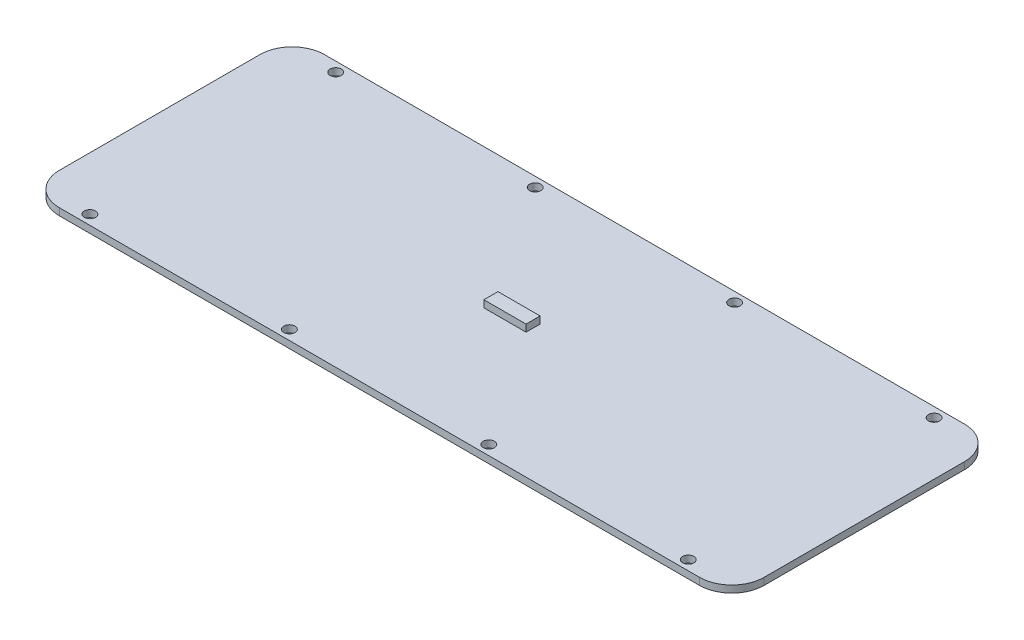
ISO-10303-21;
HEADER;
FILE_DESCRIPTION(('STEP AP214'),'2;1');
FILE_NAME('part.step','',(''),(''),'','','');
FILE_SCHEMA(('AUTOMOTIVE_DESIGN { 1 0 10303 214 1 1 1 1 }'));
ENDSEC;
DATA;
#1=APPLICATION_CONTEXT('core data for automotive mechanical design processes');
#2=APPLICATION_PROTOCOL_DEFINITION('international standard','automotive_design',2000,#1);
#3=PRODUCT_CONTEXT('',#1,'mechanical');
#4=PRODUCT('Part','Part','',(#3));
#5=PRODUCT_RELATED_PRODUCT_CATEGORY('part','',(#4));
#6=PRODUCT_DEFINITION_FORMATION('','',#4);
#7=PRODUCT_DEFINITION_CONTEXT('part definition',#1,'design');
#8=PRODUCT_DEFINITION('design','',#6,#7);
#9=PRODUCT_DEFINITION_SHAPE('','',#8);
#10=(LENGTH_UNIT() NAMED_UNIT(*) SI_UNIT(.MILLI.,.METRE.));
#11=(NAMED_UNIT(*) PLANE_ANGLE_UNIT() SI_UNIT($,.RADIAN.));
#12=(NAMED_UNIT(*) SI_UNIT($,.STERADIAN.) SOLID_ANGLE_UNIT());
#13=UNCERTAINTY_MEASURE_WITH_UNIT(LENGTH_MEASURE(1.E-05),#10,'distance_accuracy_value','');
#14=(GEOMETRIC_REPRESENTATION_CONTEXT(3) GLOBAL_UNCERTAINTY_ASSIGNED_CONTEXT((#13)) GLOBAL_UNIT_ASSIGNED_CONTEXT((#10,
#11,#12)) REPRESENTATION_CONTEXT('',''));
#15=CARTESIAN_POINT('',(0.,0.,0.));
#16=DIRECTION('',(0.,0.,1.));
#17=DIRECTION('',(1.,0.,0.));
#18=AXIS2_PLACEMENT_3D('',#15,#16,#17);
#19=CARTESIAN_POINT('',(-227.9,5.,71.4));
#20=DIRECTION('',(0.,-1.,0.));
#21=DIRECTION('',(0.,0.,-1.));
#22=AXIS2_PLACEMENT_3D('',#19,#20,#21);
#23=PLANE('',#22);
#24=CARTESIAN_POINT('',(-213.,5.,87.5));
#25=DIRECTION('',(0.,1.,0.));
#26=DIRECTION('',(0.,0.,-1.));
#27=AXIS2_PLACEMENT_3D('',#24,#25,#26);
#28=CIRCLE('',#27,3.99999999999999);
#29=CARTESIAN_POINT('',(-213.,5.,83.5));
#30=VERTEX_POINT('',#29);
#31=EDGE_CURVE('E272',#30,#30,#28,.T.);
#32=ORIENTED_EDGE('',*,*,#31,.F.);
#33=EDGE_LOOP('',(#32));
#34=FACE_BOUND('',#33,.T.);
#35=CARTESIAN_POINT('',(-70.9999999999999,5.,87.5));
#36=DIRECTION('',(0.,1.,0.));
#37=DIRECTION('',(0.,0.,-1.));
#38=AXIS2_PLACEMENT_3D('',#35,#36,#37);
#39=CIRCLE('',#38,4.00000000000001);
#40=CARTESIAN_POINT('',(-70.9999999999999,5.,83.5));
#41=VERTEX_POINT('',#40);
#42=EDGE_CURVE('E264',#41,#41,#39,.T.);
#43=ORIENTED_EDGE('',*,*,#42,.F.);
#44=EDGE_LOOP('',(#43));
#45=FACE_BOUND('',#44,.T.);
#46=CARTESIAN_POINT('',(71.0000000000001,5.,87.4999999999999));
#47=DIRECTION('',(0.,1.,0.));
#48=DIRECTION('',(0.,0.,-1.));
#49=AXIS2_PLACEMENT_3D('',#46,#47,#48);
#50=CIRCLE('',#49,4.00000000000001);
#51=CARTESIAN_POINT('',(71.0000000000001,5.,83.4999999999999));
#52=VERTEX_POINT('',#51);
#53=EDGE_CURVE('E256',#52,#52,#50,.T.);
#54=ORIENTED_EDGE('',*,*,#53,.F.);
#55=EDGE_LOOP('',(#54));
#56=FACE_BOUND('',#55,.T.);
#57=CARTESIAN_POINT('',(213.,5.,87.4999999999999));
#58=DIRECTION('',(0.,1.,0.));
#59=DIRECTION('',(0.,0.,-1.));
#60=AXIS2_PLACEMENT_3D('',#57,#58,#59);
#61=CIRCLE('',#60,3.99999999999999);
#62=CARTESIAN_POINT('',(213.,5.,83.4999999999999));
#63=VERTEX_POINT('',#62);
#64=EDGE_CURVE('E248',#63,#63,#61,.T.);
#65=ORIENTED_EDGE('',*,*,#64,.F.);
#66=EDGE_LOOP('',(#65));
#67=FACE_BOUND('',#66,.T.);
#68=CARTESIAN_POINT('',(213.,5.,-87.5));
#69=DIRECTION('',(0.,1.,0.));
#70=DIRECTION('',(0.,0.,1.));
#71=AXIS2_PLACEMENT_3D('',#68,#69,#70);
#72=CIRCLE('',#71,3.99999999999999);
#73=CARTESIAN_POINT('',(213.,5.,-83.5));
#74=VERTEX_POINT('',#73);
#75=EDGE_CURVE('E240',#74,#74,#72,.T.);
#76=ORIENTED_EDGE('',*,*,#75,.F.);
#77=EDGE_LOOP('',(#76));
#78=FACE_BOUND('',#77,.T.);
#79=CARTESIAN_POINT('',(71.0000000000001,5.,-87.5));
#80=DIRECTION('',(0.,1.,0.));
#81=DIRECTION('',(0.,0.,1.));
#82=AXIS2_PLACEMENT_3D('',#79,#80,#81);
#83=CIRCLE('',#82,4.00000000000001);
#84=CARTESIAN_POINT('',(71.0000000000001,5.,-83.5));
#85=VERTEX_POINT('',#84);
#86=EDGE_CURVE('E232',#85,#85,#83,.T.);
#87=ORIENTED_EDGE('',*,*,#86,.F.);
#88=EDGE_LOOP('',(#87));
#89=FACE_BOUND('',#88,.T.);
#90=CARTESIAN_POINT('',(-70.9999999999999,5.,-87.5));
#91=DIRECTION('',(0.,1.,0.));
#92=DIRECTION('',(0.,0.,1.));
#93=AXIS2_PLACEMENT_3D('',#90,#91,#92);
#94=CIRCLE('',#93,4.00000000000001);
#95=CARTESIAN_POINT('',(-70.9999999999999,5.,-83.4999999999999));
#96=VERTEX_POINT('',#95);
#97=EDGE_CURVE('E224',#96,#96,#94,.T.);
#98=ORIENTED_EDGE('',*,*,#97,.F.);
#99=EDGE_LOOP('',(#98));
#100=FACE_BOUND('',#99,.T.);
#101=CARTESIAN_POINT('',(-213.,5.,-87.5));
#102=DIRECTION('',(0.,1.,0.));
#103=DIRECTION('',(0.,0.,1.));
#104=AXIS2_PLACEMENT_3D('',#101,#102,#103);
#105=CIRCLE('',#104,3.99999999999999);
#106=CARTESIAN_POINT('',(-213.,5.,-83.5));
#107=VERTEX_POINT('',#106);
#108=EDGE_CURVE('E157',#107,#107,#105,.T.);
#109=ORIENTED_EDGE('',*,*,#108,.F.);
#110=EDGE_LOOP('',(#109));
#111=FACE_BOUND('',#110,.T.);
#112=CARTESIAN_POINT('',(-227.9,5.,71.4));
#113=DIRECTION('',(0.,1.,0.));
#114=DIRECTION('',(0.,0.,-1.));
#115=AXIS2_PLACEMENT_3D('',#112,#113,#114);
#116=CIRCLE('',#115,23.);
#117=CARTESIAN_POINT('',(-250.9,5.,71.4));
#118=VERTEX_POINT('',#117);
#119=CARTESIAN_POINT('',(-227.9,5.,94.4));
#120=VERTEX_POINT('',#119);
#121=EDGE_CURVE('E175',#118,#120,#116,.T.);
#122=ORIENTED_EDGE('',*,*,#121,.T.);
#123=DIRECTION('',(1.,0.,0.));
#124=VECTOR('',#123,1.);
#125=CARTESIAN_POINT('',(-227.9,5.,94.4));
#126=LINE('',#125,#124);
#127=CARTESIAN_POINT('',(227.9,5.,94.4));
#128=VERTEX_POINT('',#127);
#129=EDGE_CURVE('E109',#120,#128,#126,.T.);
#130=ORIENTED_EDGE('',*,*,#129,.T.);
#131=CARTESIAN_POINT('',(227.9,5.,71.4));
#132=DIRECTION('',(0.,1.,0.));
#133=DIRECTION('',(0.,0.,1.));
#134=AXIS2_PLACEMENT_3D('',#131,#132,#133);
#135=CIRCLE('',#134,23.);
#136=CARTESIAN_POINT('',(250.9,5.,71.4));
#137=VERTEX_POINT('',#136);
#138=EDGE_CURVE('E196',#128,#137,#135,.T.);
#139=ORIENTED_EDGE('',*,*,#138,.T.);
#140=DIRECTION('',(0.,0.,-1.));
#141=VECTOR('',#140,1.);
#142=CARTESIAN_POINT('',(250.9,5.,71.4));
#143=LINE('',#142,#141);
#144=CARTESIAN_POINT('',(250.9,5.,-71.4));
#145=VERTEX_POINT('',#144);
#146=EDGE_CURVE('E210',#137,#145,#143,.T.);
#147=ORIENTED_EDGE('',*,*,#146,.T.);
#148=CARTESIAN_POINT('',(227.9,5.,-71.4));
#149=DIRECTION('',(0.,1.,0.));
#150=DIRECTION('',(0.,0.,-1.));
#151=AXIS2_PLACEMENT_3D('',#148,#149,#150);
#152=CIRCLE('',#151,23.);
#153=CARTESIAN_POINT('',(227.9,5.,-94.4));
#154=VERTEX_POINT('',#153);
#155=EDGE_CURVE('E130',#145,#154,#152,.T.);
#156=ORIENTED_EDGE('',*,*,#155,.T.);
#157=DIRECTION('',(-1.,0.,0.));
#158=VECTOR('',#157,1.);
#159=CARTESIAN_POINT('',(-227.9,5.,-94.4));
#160=LINE('',#159,#158);
#161=CARTESIAN_POINT('',(-227.9,5.,-94.4));
#162=VERTEX_POINT('',#161);
#163=EDGE_CURVE('E124',#154,#162,#160,.T.);
#164=ORIENTED_EDGE('',*,*,#163,.T.);
#165=CARTESIAN_POINT('',(-227.9,5.,-71.4));
#166=DIRECTION('',(0.,1.,0.));
#167=DIRECTION('',(0.,0.,-1.));
#168=AXIS2_PLACEMENT_3D('',#165,#166,#167);
#169=CIRCLE('',#168,23.);
#170=CARTESIAN_POINT('',(-250.9,5.,-71.4));
#171=VERTEX_POINT('',#170);
#172=EDGE_CURVE('E128',#162,#171,#169,.T.);
#173=ORIENTED_EDGE('',*,*,#172,.T.);
#174=DIRECTION('',(0.,0.,1.));
#175=VECTOR('',#174,1.);
#176=CARTESIAN_POINT('',(-250.9,5.,71.4));
#177=LINE('',#176,#175);
#178=EDGE_CURVE('E65',#171,#118,#177,.T.);
#179=ORIENTED_EDGE('',*,*,#178,.T.);
#180=EDGE_LOOP('',(#122,#130,#139,#147,#156,#164,#173,#179));
#181=FACE_BOUND('',#180,.T.);
#182=DIRECTION('',(0.,0.,-1.));
#183=VECTOR('',#182,1.);
#184=CARTESIAN_POINT('',(15.,5.,5.00000000000003));
#185=LINE('',#184,#183);
#186=CARTESIAN_POINT('',(15.,5.,5.00000000000003));
#187=VERTEX_POINT('',#186);
#188=CARTESIAN_POINT('',(15.,5.,-4.99999999999997));
#189=VERTEX_POINT('',#188);
#190=EDGE_CURVE('E295',#187,#189,#185,.T.);
#191=ORIENTED_EDGE('',*,*,#190,.F.);
#192=DIRECTION('',(1.,0.,0.));
#193=VECTOR('',#192,1.);
#194=CARTESIAN_POINT('',(-15.,5.,5.00000000000003));
#195=LINE('',#194,#193);
#196=CARTESIAN_POINT('',(-15.,5.,5.00000000000003));
#197=VERTEX_POINT('',#196);
#198=EDGE_CURVE('E280',#197,#187,#195,.T.);
#199=ORIENTED_EDGE('',*,*,#198,.F.);
#200=DIRECTION('',(0.,0.,1.));
#201=VECTOR('',#200,1.);
#202=CARTESIAN_POINT('',(-15.,5.,5.00000000000003));
#203=LINE('',#202,#201);
#204=CARTESIAN_POINT('',(-15.,5.,-4.99999999999997));
#205=VERTEX_POINT('',#204);
#206=EDGE_CURVE('E287',#205,#197,#203,.T.);
#207=ORIENTED_EDGE('',*,*,#206,.F.);
#208=DIRECTION('',(-1.,0.,0.));
#209=VECTOR('',#208,1.);
#210=CARTESIAN_POINT('',(-15.,5.,-4.99999999999997));
#211=LINE('',#210,#209);
#212=EDGE_CURVE('E291',#189,#205,#211,.T.);
#213=ORIENTED_EDGE('',*,*,#212,.F.);
#214=EDGE_LOOP('',(#191,#199,#207,#213));
#215=FACE_BOUND('',#214,.T.);
#216=ADVANCED_FACE('F47',(#34,#45,#56,#67,#78,#89,#100,#111,#181,#215),#23,.F.);
#217=CARTESIAN_POINT('',(-227.9,0.,71.4));
#218=DIRECTION('',(0.,-1.,0.));
#219=DIRECTION('',(0.,0.,-1.));
#220=AXIS2_PLACEMENT_3D('',#217,#218,#219);
#221=PLANE('',#220);
#222=CARTESIAN_POINT('',(-70.9999999999999,0.,87.5));
#223=DIRECTION('',(0.,1.,0.));
#224=DIRECTION('',(0.,0.,-1.));
#225=AXIS2_PLACEMENT_3D('',#222,#223,#224);
#226=CIRCLE('',#225,4.00000000000001);
#227=CARTESIAN_POINT('',(-70.9999999999999,0.,83.5));
#228=VERTEX_POINT('',#227);
#229=EDGE_CURVE('E268',#228,#228,#226,.T.);
#230=ORIENTED_EDGE('',*,*,#229,.T.);
#231=EDGE_LOOP('',(#230));
#232=FACE_BOUND('',#231,.T.);
#233=CARTESIAN_POINT('',(213.,0.,87.4999999999999));
#234=DIRECTION('',(0.,1.,0.));
#235=DIRECTION('',(0.,0.,-1.));
#236=AXIS2_PLACEMENT_3D('',#233,#234,#235);
#237=CIRCLE('',#236,3.99999999999999);
#238=CARTESIAN_POINT('',(213.,0.,83.4999999999999));
#239=VERTEX_POINT('',#238);
#240=EDGE_CURVE('E252',#239,#239,#237,.T.);
#241=ORIENTED_EDGE('',*,*,#240,.T.);
#242=EDGE_LOOP('',(#241));
#243=FACE_BOUND('',#242,.T.);
#244=CARTESIAN_POINT('',(71.0000000000001,0.,-87.5));
#245=DIRECTION('',(0.,1.,0.));
#246=DIRECTION('',(0.,0.,1.));
#247=AXIS2_PLACEMENT_3D('',#244,#245,#246);
#248=CIRCLE('',#247,4.00000000000001);
#249=CARTESIAN_POINT('',(71.0000000000001,0.,-83.5));
#250=VERTEX_POINT('',#249);
#251=EDGE_CURVE('E236',#250,#250,#248,.T.);
#252=ORIENTED_EDGE('',*,*,#251,.T.);
#253=EDGE_LOOP('',(#252));
#254=FACE_BOUND('',#253,.T.);
#255=CARTESIAN_POINT('',(-213.,0.,-87.5));
#256=DIRECTION('',(0.,1.,0.));
#257=DIRECTION('',(0.,0.,1.));
#258=AXIS2_PLACEMENT_3D('',#255,#256,#257);
#259=CIRCLE('',#258,3.99999999999999);
#260=CARTESIAN_POINT('',(-213.,0.,-83.5));
#261=VERTEX_POINT('',#260);
#262=EDGE_CURVE('E220',#261,#261,#259,.T.);
#263=ORIENTED_EDGE('',*,*,#262,.T.);
#264=EDGE_LOOP('',(#263));
#265=FACE_BOUND('',#264,.T.);
#266=CARTESIAN_POINT('',(-227.9,0.,71.4));
#267=DIRECTION('',(0.,1.,0.));
#268=DIRECTION('',(0.,0.,-1.));
#269=AXIS2_PLACEMENT_3D('',#266,#267,#268);
#270=CIRCLE('',#269,23.);
#271=CARTESIAN_POINT('',(-250.9,0.,71.4));
#272=VERTEX_POINT('',#271);
#273=CARTESIAN_POINT('',(-227.9,0.,94.4));
#274=VERTEX_POINT('',#273);
#275=EDGE_CURVE('E152',#272,#274,#270,.T.);
#276=ORIENTED_EDGE('',*,*,#275,.F.);
#277=DIRECTION('',(0.,0.,1.));
#278=VECTOR('',#277,1.);
#279=CARTESIAN_POINT('',(-250.9,0.,71.4));
#280=LINE('',#279,#278);
#281=CARTESIAN_POINT('',(-250.9,0.,-71.4));
#282=VERTEX_POINT('',#281);
#283=EDGE_CURVE('E101',#282,#272,#280,.T.);
#284=ORIENTED_EDGE('',*,*,#283,.F.);
#285=CARTESIAN_POINT('',(-227.9,0.,-71.4));
#286=DIRECTION('',(0.,1.,0.));
#287=DIRECTION('',(0.,0.,-1.));
#288=AXIS2_PLACEMENT_3D('',#285,#286,#287);
#289=CIRCLE('',#288,23.);
#290=CARTESIAN_POINT('',(-227.9,0.,-94.4));
#291=VERTEX_POINT('',#290);
#292=EDGE_CURVE('E95',#291,#282,#289,.T.);
#293=ORIENTED_EDGE('',*,*,#292,.F.);
#294=DIRECTION('',(-1.,0.,0.));
#295=VECTOR('',#294,1.);
#296=CARTESIAN_POINT('',(-227.9,0.,-94.4));
#297=LINE('',#296,#295);
#298=CARTESIAN_POINT('',(227.9,0.,-94.4));
#299=VERTEX_POINT('',#298);
#300=EDGE_CURVE('E139',#299,#291,#297,.T.);
#301=ORIENTED_EDGE('',*,*,#300,.F.);
#302=CARTESIAN_POINT('',(227.9,0.,-71.4));
#303=DIRECTION('',(0.,1.,0.));
#304=DIRECTION('',(0.,0.,-1.));
#305=AXIS2_PLACEMENT_3D('',#302,#303,#304);
#306=CIRCLE('',#305,23.);
#307=CARTESIAN_POINT('',(250.9,0.,-71.4));
#308=VERTEX_POINT('',#307);
#309=EDGE_CURVE('E166',#308,#299,#306,.T.);
#310=ORIENTED_EDGE('',*,*,#309,.F.);
#311=DIRECTION('',(0.,0.,-1.));
#312=VECTOR('',#311,1.);
#313=CARTESIAN_POINT('',(250.9,0.,71.4));
#314=LINE('',#313,#312);
#315=CARTESIAN_POINT('',(250.9,0.,71.4));
#316=VERTEX_POINT('',#315);
#317=EDGE_CURVE('E163',#316,#308,#314,.T.);
#318=ORIENTED_EDGE('',*,*,#317,.F.);
#319=CARTESIAN_POINT('',(227.9,0.,71.4));
#320=DIRECTION('',(0.,1.,0.));
#321=DIRECTION('',(0.,0.,1.));
#322=AXIS2_PLACEMENT_3D('',#319,#320,#321);
#323=CIRCLE('',#322,23.);
#324=CARTESIAN_POINT('',(227.9,0.,94.4));
#325=VERTEX_POINT('',#324);
#326=EDGE_CURVE('E160',#325,#316,#323,.T.);
#327=ORIENTED_EDGE('',*,*,#326,.F.);
#328=DIRECTION('',(1.,0.,0.));
#329=VECTOR('',#328,1.);
#330=CARTESIAN_POINT('',(-227.9,0.,94.4));
#331=LINE('',#330,#329);
#332=EDGE_CURVE('E156',#274,#325,#331,.T.);
#333=ORIENTED_EDGE('',*,*,#332,.F.);
#334=EDGE_LOOP('',(#276,#284,#293,#301,#310,#318,#327,#333));
#335=FACE_BOUND('',#334,.T.);
#336=CARTESIAN_POINT('',(-70.9999999999999,0.,-87.5));
#337=DIRECTION('',(0.,1.,0.));
#338=DIRECTION('',(0.,0.,1.));
#339=AXIS2_PLACEMENT_3D('',#336,#337,#338);
#340=CIRCLE('',#339,4.00000000000001);
#341=CARTESIAN_POINT('',(-70.9999999999999,0.,-83.4999999999999));
#342=VERTEX_POINT('',#341);
#343=EDGE_CURVE('E228',#342,#342,#340,.T.);
#344=ORIENTED_EDGE('',*,*,#343,.T.);
#345=EDGE_LOOP('',(#344));
#346=FACE_BOUND('',#345,.T.);
#347=CARTESIAN_POINT('',(213.,0.,-87.5));
#348=DIRECTION('',(0.,1.,0.));
#349=DIRECTION('',(0.,0.,1.));
#350=AXIS2_PLACEMENT_3D('',#347,#348,#349);
#351=CIRCLE('',#350,3.99999999999999);
#352=CARTESIAN_POINT('',(213.,0.,-83.5));
#353=VERTEX_POINT('',#352);
#354=EDGE_CURVE('E244',#353,#353,#351,.T.);
#355=ORIENTED_EDGE('',*,*,#354,.T.);
#356=EDGE_LOOP('',(#355));
#357=FACE_BOUND('',#356,.T.);
#358=CARTESIAN_POINT('',(71.0000000000001,0.,87.4999999999999));
#359=DIRECTION('',(0.,1.,0.));
#360=DIRECTION('',(0.,0.,-1.));
#361=AXIS2_PLACEMENT_3D('',#358,#359,#360);
#362=CIRCLE('',#361,4.00000000000001);
#363=CARTESIAN_POINT('',(71.0000000000001,0.,83.4999999999999));
#364=VERTEX_POINT('',#363);
#365=EDGE_CURVE('E260',#364,#364,#362,.T.);
#366=ORIENTED_EDGE('',*,*,#365,.T.);
#367=EDGE_LOOP('',(#366));
#368=FACE_BOUND('',#367,.T.);
#369=CARTESIAN_POINT('',(-213.,0.,87.5));
#370=DIRECTION('',(0.,1.,0.));
#371=DIRECTION('',(0.,0.,-1.));
#372=AXIS2_PLACEMENT_3D('',#369,#370,#371);
#373=CIRCLE('',#372,3.99999999999999);
#374=CARTESIAN_POINT('',(-213.,0.,83.5));
#375=VERTEX_POINT('',#374);
#376=EDGE_CURVE('E276',#375,#375,#373,.T.);
#377=ORIENTED_EDGE('',*,*,#376,.T.);
#378=EDGE_LOOP('',(#377));
#379=FACE_BOUND('',#378,.T.);
#380=ADVANCED_FACE('F200',(#232,#243,#254,#265,#335,#346,#357,#368,#379),#221,.T.);
#381=CARTESIAN_POINT('',(-227.9,5.,71.4));
#382=DIRECTION('',(0.,-1.,0.));
#383=DIRECTION('',(0.,0.,-1.));
#384=AXIS2_PLACEMENT_3D('',#381,#382,#383);
#385=CYLINDRICAL_SURFACE('',#384,23.);
#386=ORIENTED_EDGE('',*,*,#275,.T.);
#387=DIRECTION('',(0.,-1.,0.));
#388=VECTOR('',#387,1.);
#389=CARTESIAN_POINT('',(-227.9,5.,94.4));
#390=LINE('',#389,#388);
#391=EDGE_CURVE('E11',#120,#274,#390,.T.);
#392=ORIENTED_EDGE('',*,*,#391,.F.);
#393=ORIENTED_EDGE('',*,*,#121,.F.);
#394=DIRECTION('',(0.,-1.,0.));
#395=VECTOR('',#394,1.);
#396=CARTESIAN_POINT('',(-250.9,5.,71.4));
#397=LINE('',#396,#395);
#398=EDGE_CURVE('E148',#118,#272,#397,.T.);
#399=ORIENTED_EDGE('',*,*,#398,.T.);
#400=EDGE_LOOP('',(#386,#392,#393,#399));
#401=FACE_BOUND('',#400,.T.);
#402=ADVANCED_FACE('F49',(#401),#385,.T.);
#403=CARTESIAN_POINT('',(-227.9,5.,94.4));
#404=DIRECTION('',(0.,0.,-1.));
#405=DIRECTION('',(-1.,0.,0.));
#406=AXIS2_PLACEMENT_3D('',#403,#404,#405);
#407=PLANE('',#406);
#408=ORIENTED_EDGE('',*,*,#332,.T.);
#409=DIRECTION('',(0.,-1.,0.));
#410=VECTOR('',#409,1.);
#411=CARTESIAN_POINT('',(227.9,5.,94.4));
#412=LINE('',#411,#410);
#413=EDGE_CURVE('E57',#128,#325,#412,.T.);
#414=ORIENTED_EDGE('',*,*,#413,.F.);
#415=ORIENTED_EDGE('',*,*,#129,.F.);
#416=ORIENTED_EDGE('',*,*,#391,.T.);
#417=EDGE_LOOP('',(#408,#414,#415,#416));
#418=FACE_BOUND('',#417,.T.);
#419=ADVANCED_FACE('F401',(#418),#407,.F.);
#420=CARTESIAN_POINT('',(227.9,5.,71.4));
#421=DIRECTION('',(0.,-1.,0.));
#422=DIRECTION('',(0.,0.,-1.));
#423=AXIS2_PLACEMENT_3D('',#420,#421,#422);
#424=CYLINDRICAL_SURFACE('',#423,23.);
#425=ORIENTED_EDGE('',*,*,#326,.T.);
#426=DIRECTION('',(0.,-1.,0.));
#427=VECTOR('',#426,1.);
#428=CARTESIAN_POINT('',(250.9,5.,71.4));
#429=LINE('',#428,#427);
#430=EDGE_CURVE('E186',#137,#316,#429,.T.);
#431=ORIENTED_EDGE('',*,*,#430,.F.);
#432=ORIENTED_EDGE('',*,*,#138,.F.);
#433=ORIENTED_EDGE('',*,*,#413,.T.);
#434=EDGE_LOOP('',(#425,#431,#432,#433));
#435=FACE_BOUND('',#434,.T.);
#436=ADVANCED_FACE('F194',(#435),#424,.T.);
#437=CARTESIAN_POINT('',(250.9,5.,71.4));
#438=DIRECTION('',(-1.,0.,0.));
#439=DIRECTION('',(0.,0.,1.));
#440=AXIS2_PLACEMENT_3D('',#437,#438,#439);
#441=PLANE('',#440);
#442=ORIENTED_EDGE('',*,*,#317,.T.);
#443=DIRECTION('',(0.,-1.,0.));
#444=VECTOR('',#443,1.);
#445=CARTESIAN_POINT('',(250.9,5.,-71.4));
#446=LINE('',#445,#444);
#447=EDGE_CURVE('E182',#145,#308,#446,.T.);
#448=ORIENTED_EDGE('',*,*,#447,.F.);
#449=ORIENTED_EDGE('',*,*,#146,.F.);
#450=ORIENTED_EDGE('',*,*,#430,.T.);
#451=EDGE_LOOP('',(#442,#448,#449,#450));
#452=FACE_BOUND('',#451,.T.);
#453=ADVANCED_FACE('F205',(#452),#441,.F.);
#454=CARTESIAN_POINT('',(227.9,5.,-71.4));
#455=DIRECTION('',(0.,-1.,0.));
#456=DIRECTION('',(0.,0.,-1.));
#457=AXIS2_PLACEMENT_3D('',#454,#455,#456);
#458=CYLINDRICAL_SURFACE('',#457,23.);
#459=ORIENTED_EDGE('',*,*,#309,.T.);
#460=DIRECTION('',(0.,-1.,0.));
#461=VECTOR('',#460,1.);
#462=CARTESIAN_POINT('',(227.9,5.,-94.4));
#463=LINE('',#462,#461);
#464=EDGE_CURVE('E141',#154,#299,#463,.T.);
#465=ORIENTED_EDGE('',*,*,#464,.F.);
#466=ORIENTED_EDGE('',*,*,#155,.F.);
#467=ORIENTED_EDGE('',*,*,#447,.T.);
#468=EDGE_LOOP('',(#459,#465,#466,#467));
#469=FACE_BOUND('',#468,.T.);
#470=ADVANCED_FACE('F208',(#469),#458,.T.);
#471=CARTESIAN_POINT('',(-227.9,5.,-94.4));
#472=DIRECTION('',(0.,0.,1.));
#473=DIRECTION('',(1.,0.,0.));
#474=AXIS2_PLACEMENT_3D('',#471,#472,#473);
#475=PLANE('',#474);
#476=ORIENTED_EDGE('',*,*,#300,.T.);
#477=DIRECTION('',(0.,-1.,0.));
#478=VECTOR('',#477,1.);
#479=CARTESIAN_POINT('',(-227.9,5.,-94.4));
#480=LINE('',#479,#478);
#481=EDGE_CURVE('E136',#162,#291,#480,.T.);
#482=ORIENTED_EDGE('',*,*,#481,.F.);
#483=ORIENTED_EDGE('',*,*,#163,.F.);
#484=ORIENTED_EDGE('',*,*,#464,.T.);
#485=EDGE_LOOP('',(#476,#482,#483,#484));
#486=FACE_BOUND('',#485,.T.);
#487=ADVANCED_FACE('F137',(#486),#475,.F.);
#488=CARTESIAN_POINT('',(-227.9,5.,-71.4));
#489=DIRECTION('',(0.,-1.,0.));
#490=DIRECTION('',(0.,0.,-1.));
#491=AXIS2_PLACEMENT_3D('',#488,#489,#490);
#492=CYLINDRICAL_SURFACE('',#491,23.);
#493=ORIENTED_EDGE('',*,*,#292,.T.);
#494=DIRECTION('',(0.,-1.,0.));
#495=VECTOR('',#494,1.);
#496=CARTESIAN_POINT('',(-250.9,5.,-71.4));
#497=LINE('',#496,#495);
#498=EDGE_CURVE('E142',#171,#282,#497,.T.);
#499=ORIENTED_EDGE('',*,*,#498,.F.);
#500=ORIENTED_EDGE('',*,*,#172,.F.);
#501=ORIENTED_EDGE('',*,*,#481,.T.);
#502=EDGE_LOOP('',(#493,#499,#500,#501));
#503=FACE_BOUND('',#502,.T.);
#504=ADVANCED_FACE('F144',(#503),#492,.T.);
#505=CARTESIAN_POINT('',(-250.9,5.,71.4));
#506=DIRECTION('',(1.,0.,0.));
#507=DIRECTION('',(0.,0.,-1.));
#508=AXIS2_PLACEMENT_3D('',#505,#506,#507);
#509=PLANE('',#508);
#510=ORIENTED_EDGE('',*,*,#283,.T.);
#511=ORIENTED_EDGE('',*,*,#398,.F.);
#512=ORIENTED_EDGE('',*,*,#178,.F.);
#513=ORIENTED_EDGE('',*,*,#498,.T.);
#514=EDGE_LOOP('',(#510,#511,#512,#513));
#515=FACE_BOUND('',#514,.T.);
#516=ADVANCED_FACE('F389',(#515),#509,.F.);
#517=CARTESIAN_POINT('',(-213.,5.,-87.5));
#518=DIRECTION('',(0.,-1.,0.));
#519=DIRECTION('',(0.,0.,-1.));
#520=AXIS2_PLACEMENT_3D('',#517,#518,#519);
#521=CYLINDRICAL_SURFACE('',#520,3.99999999999999);
#522=ORIENTED_EDGE('',*,*,#108,.T.);
#523=EDGE_LOOP('',(#522));
#524=FACE_BOUND('',#523,.T.);
#525=ORIENTED_EDGE('',*,*,#262,.F.);
#526=EDGE_LOOP('',(#525));
#527=FACE_BOUND('',#526,.T.);
#528=ADVANCED_FACE('F386',(#524,#527),#521,.F.);
#529=CARTESIAN_POINT('',(-70.9999999999999,5.,-87.5));
#530=DIRECTION('',(0.,-1.,0.));
#531=DIRECTION('',(0.,0.,-1.));
#532=AXIS2_PLACEMENT_3D('',#529,#530,#531);
#533=CYLINDRICAL_SURFACE('',#532,4.00000000000001);
#534=ORIENTED_EDGE('',*,*,#97,.T.);
#535=EDGE_LOOP('',(#534));
#536=FACE_BOUND('',#535,.T.);
#537=ORIENTED_EDGE('',*,*,#343,.F.);
#538=EDGE_LOOP('',(#537));
#539=FACE_BOUND('',#538,.T.);
#540=ADVANCED_FACE('F466',(#536,#539),#533,.F.);
#541=CARTESIAN_POINT('',(71.0000000000001,5.,-87.5));
#542=DIRECTION('',(0.,-1.,0.));
#543=DIRECTION('',(0.,0.,-1.));
#544=AXIS2_PLACEMENT_3D('',#541,#542,#543);
#545=CYLINDRICAL_SURFACE('',#544,4.00000000000001);
#546=ORIENTED_EDGE('',*,*,#86,.T.);
#547=EDGE_LOOP('',(#546));
#548=FACE_BOUND('',#547,.T.);
#549=ORIENTED_EDGE('',*,*,#251,.F.);
#550=EDGE_LOOP('',(#549));
#551=FACE_BOUND('',#550,.T.);
#552=ADVANCED_FACE('F475',(#548,#551),#545,.F.);
#553=CARTESIAN_POINT('',(213.,5.,-87.5));
#554=DIRECTION('',(0.,-1.,0.));
#555=DIRECTION('',(0.,0.,-1.));
#556=AXIS2_PLACEMENT_3D('',#553,#554,#555);
#557=CYLINDRICAL_SURFACE('',#556,3.99999999999999);
#558=ORIENTED_EDGE('',*,*,#75,.T.);
#559=EDGE_LOOP('',(#558));
#560=FACE_BOUND('',#559,.T.);
#561=ORIENTED_EDGE('',*,*,#354,.F.);
#562=EDGE_LOOP('',(#561));
#563=FACE_BOUND('',#562,.T.);
#564=ADVANCED_FACE('F484',(#560,#563),#557,.F.);
#565=CARTESIAN_POINT('',(213.,5.,87.4999999999999));
#566=DIRECTION('',(0.,-1.,0.));
#567=DIRECTION('',(0.,0.,-1.));
#568=AXIS2_PLACEMENT_3D('',#565,#566,#567);
#569=CYLINDRICAL_SURFACE('',#568,3.99999999999999);
#570=ORIENTED_EDGE('',*,*,#64,.T.);
#571=EDGE_LOOP('',(#570));
#572=FACE_BOUND('',#571,.T.);
#573=ORIENTED_EDGE('',*,*,#240,.F.);
#574=EDGE_LOOP('',(#573));
#575=FACE_BOUND('',#574,.T.);
#576=ADVANCED_FACE('F494',(#572,#575),#569,.F.);
#577=CARTESIAN_POINT('',(71.0000000000001,5.,87.4999999999999));
#578=DIRECTION('',(0.,-1.,0.));
#579=DIRECTION('',(0.,0.,-1.));
#580=AXIS2_PLACEMENT_3D('',#577,#578,#579);
#581=CYLINDRICAL_SURFACE('',#580,4.00000000000001);
#582=ORIENTED_EDGE('',*,*,#53,.T.);
#583=EDGE_LOOP('',(#582));
#584=FACE_BOUND('',#583,.T.);
#585=ORIENTED_EDGE('',*,*,#365,.F.);
#586=EDGE_LOOP('',(#585));
#587=FACE_BOUND('',#586,.T.);
#588=ADVANCED_FACE('F504',(#584,#587),#581,.F.);
#589=CARTESIAN_POINT('',(-70.9999999999999,5.,87.5));
#590=DIRECTION('',(0.,-1.,0.));
#591=DIRECTION('',(0.,0.,-1.));
#592=AXIS2_PLACEMENT_3D('',#589,#590,#591);
#593=CYLINDRICAL_SURFACE('',#592,4.00000000000001);
#594=ORIENTED_EDGE('',*,*,#42,.T.);
#595=EDGE_LOOP('',(#594));
#596=FACE_BOUND('',#595,.T.);
#597=ORIENTED_EDGE('',*,*,#229,.F.);
#598=EDGE_LOOP('',(#597));
#599=FACE_BOUND('',#598,.T.);
#600=ADVANCED_FACE('F514',(#596,#599),#593,.F.);
#601=CARTESIAN_POINT('',(-213.,5.,87.5));
#602=DIRECTION('',(0.,-1.,0.));
#603=DIRECTION('',(0.,0.,-1.));
#604=AXIS2_PLACEMENT_3D('',#601,#602,#603);
#605=CYLINDRICAL_SURFACE('',#604,3.99999999999999);
#606=ORIENTED_EDGE('',*,*,#31,.T.);
#607=EDGE_LOOP('',(#606));
#608=FACE_BOUND('',#607,.T.);
#609=ORIENTED_EDGE('',*,*,#376,.F.);
#610=EDGE_LOOP('',(#609));
#611=FACE_BOUND('',#610,.T.);
#612=ADVANCED_FACE('F524',(#608,#611),#605,.F.);
#613=CARTESIAN_POINT('',(0.,10.,5.00000000000003));
#614=DIRECTION('',(0.,0.,-1.));
#615=DIRECTION('',(-1.,0.,0.));
#616=AXIS2_PLACEMENT_3D('',#613,#614,#615);
#617=PLANE('',#616);
#618=DIRECTION('',(0.,-1.,0.));
#619=VECTOR('',#618,1.);
#620=CARTESIAN_POINT('',(-15.,10.,5.00000000000003));
#621=LINE('',#620,#619);
#622=CARTESIAN_POINT('',(-15.,10.,5.00000000000003));
#623=VERTEX_POINT('',#622);
#624=EDGE_CURVE('E311',#623,#197,#621,.T.);
#625=ORIENTED_EDGE('',*,*,#624,.T.);
#626=ORIENTED_EDGE('',*,*,#198,.T.);
#627=DIRECTION('',(0.,-1.,0.));
#628=VECTOR('',#627,1.);
#629=CARTESIAN_POINT('',(15.,10.,5.00000000000003));
#630=LINE('',#629,#628);
#631=CARTESIAN_POINT('',(15.,10.,5.00000000000003));
#632=VERTEX_POINT('',#631);
#633=EDGE_CURVE('E299',#632,#187,#630,.T.);
#634=ORIENTED_EDGE('',*,*,#633,.F.);
#635=DIRECTION('',(1.,0.,0.));
#636=VECTOR('',#635,1.);
#637=CARTESIAN_POINT('',(0.,10.,5.00000000000003));
#638=LINE('',#637,#636);
#639=EDGE_CURVE('E327',#623,#632,#638,.T.);
#640=ORIENTED_EDGE('',*,*,#639,.F.);
#641=EDGE_LOOP('',(#625,#626,#634,#640));
#642=FACE_BOUND('',#641,.T.);
#643=ADVANCED_FACE('F343',(#642),#617,.F.);
#644=CARTESIAN_POINT('',(0.,10.,-4.99999999999997));
#645=DIRECTION('',(0.,0.,-1.));
#646=DIRECTION('',(-1.,0.,0.));
#647=AXIS2_PLACEMENT_3D('',#644,#645,#646);
#648=PLANE('',#647);
#649=ORIENTED_EDGE('',*,*,#212,.T.);
#650=DIRECTION('',(0.,-1.,0.));
#651=VECTOR('',#650,1.);
#652=CARTESIAN_POINT('',(-15.,10.,-4.99999999999997));
#653=LINE('',#652,#651);
#654=CARTESIAN_POINT('',(-15.,10.,-4.99999999999997));
#655=VERTEX_POINT('',#654);
#656=EDGE_CURVE('E307',#655,#205,#653,.T.);
#657=ORIENTED_EDGE('',*,*,#656,.F.);
#658=DIRECTION('',(1.,0.,0.));
#659=VECTOR('',#658,1.);
#660=CARTESIAN_POINT('',(0.,10.,-4.99999999999997));
#661=LINE('',#660,#659);
#662=CARTESIAN_POINT('',(15.,10.,-4.99999999999997));
#663=VERTEX_POINT('',#662);
#664=EDGE_CURVE('E319',#655,#663,#661,.T.);
#665=ORIENTED_EDGE('',*,*,#664,.T.);
#666=DIRECTION('',(0.,-1.,0.));
#667=VECTOR('',#666,1.);
#668=CARTESIAN_POINT('',(15.,10.,-4.99999999999997));
#669=LINE('',#668,#667);
#670=EDGE_CURVE('E303',#663,#189,#669,.T.);
#671=ORIENTED_EDGE('',*,*,#670,.T.);
#672=EDGE_LOOP('',(#649,#657,#665,#671));
#673=FACE_BOUND('',#672,.T.);
#674=ADVANCED_FACE('F362',(#673),#648,.T.);
#675=CARTESIAN_POINT('',(15.,10.,0.));
#676=DIRECTION('',(-1.,0.,0.));
#677=DIRECTION('',(0.,0.,1.));
#678=AXIS2_PLACEMENT_3D('',#675,#676,#677);
#679=PLANE('',#678);
#680=ORIENTED_EDGE('',*,*,#633,.T.);
#681=ORIENTED_EDGE('',*,*,#190,.T.);
#682=ORIENTED_EDGE('',*,*,#670,.F.);
#683=DIRECTION('',(0.,0.,-1.));
#684=VECTOR('',#683,1.);
#685=CARTESIAN_POINT('',(15.,10.,0.));
#686=LINE('',#685,#684);
#687=EDGE_CURVE('E323',#632,#663,#686,.T.);
#688=ORIENTED_EDGE('',*,*,#687,.F.);
#689=EDGE_LOOP('',(#680,#681,#682,#688));
#690=FACE_BOUND('',#689,.T.);
#691=ADVANCED_FACE('F346',(#690),#679,.F.);
#692=CARTESIAN_POINT('',(-15.,10.,0.));
#693=DIRECTION('',(-1.,0.,0.));
#694=DIRECTION('',(0.,0.,1.));
#695=AXIS2_PLACEMENT_3D('',#692,#693,#694);
#696=PLANE('',#695);
#697=ORIENTED_EDGE('',*,*,#206,.T.);
#698=ORIENTED_EDGE('',*,*,#624,.F.);
#699=DIRECTION('',(0.,0.,-1.));
#700=VECTOR('',#699,1.);
#701=CARTESIAN_POINT('',(-15.,10.,0.));
#702=LINE('',#701,#700);
#703=EDGE_CURVE('E315',#623,#655,#702,.T.);
#704=ORIENTED_EDGE('',*,*,#703,.T.);
#705=ORIENTED_EDGE('',*,*,#656,.T.);
#706=EDGE_LOOP('',(#697,#698,#704,#705));
#707=FACE_BOUND('',#706,.T.);
#708=ADVANCED_FACE('F364',(#707),#696,.T.);
#709=CARTESIAN_POINT('',(0.,10.,0.));
#710=DIRECTION('',(0.,1.,0.));
#711=DIRECTION('',(0.,0.,1.));
#712=AXIS2_PLACEMENT_3D('',#709,#710,#711);
#713=PLANE('',#712);
#714=ORIENTED_EDGE('',*,*,#639,.T.);
#715=ORIENTED_EDGE('',*,*,#687,.T.);
#716=ORIENTED_EDGE('',*,*,#664,.F.);
#717=ORIENTED_EDGE('',*,*,#703,.F.);
#718=EDGE_LOOP('',(#714,#715,#716,#717));
#719=FACE_BOUND('',#718,.T.);
#720=ADVANCED_FACE('F335',(#719),#713,.T.);
#721=CLOSED_SHELL('',(#216,#380,#402,#419,#436,#453,#470,#487,#504,#516,#528,#540,#552,#564,
#576,#588,#600,#612,#643,#674,#691,#708,#720));
#722=MANIFOLD_SOLID_BREP('B2',#721);
#723=ADVANCED_BREP_SHAPE_REPRESENTATION('',(#18,#722),#14);
#724=SHAPE_DEFINITION_REPRESENTATION(#9,#723);
ENDSEC;
END-ISO-10303-21;
